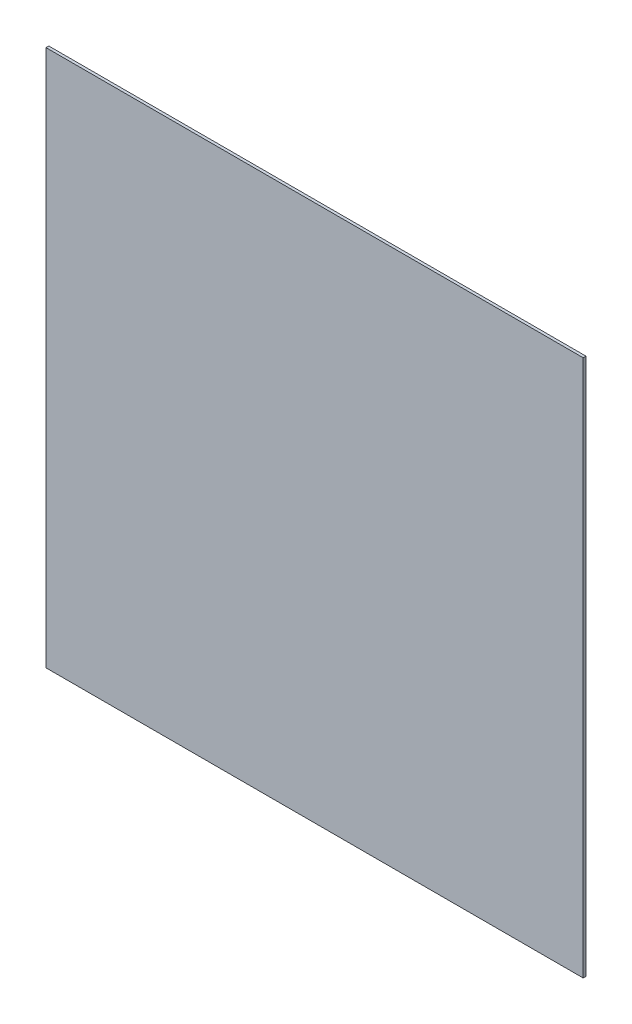
ISO-10303-21;
HEADER;
FILE_DESCRIPTION(('STEP AP214'),'2;1');
FILE_NAME('part.step','',(''),(''),'','','');
FILE_SCHEMA(('AUTOMOTIVE_DESIGN { 1 0 10303 214 1 1 1 1 }'));
ENDSEC;
DATA;
#1=APPLICATION_CONTEXT('core data for automotive mechanical design processes');
#2=APPLICATION_PROTOCOL_DEFINITION('international standard','automotive_design',2000,#1);
#3=PRODUCT_CONTEXT('',#1,'mechanical');
#4=PRODUCT('Part','Part','',(#3));
#5=PRODUCT_RELATED_PRODUCT_CATEGORY('part','',(#4));
#6=PRODUCT_DEFINITION_FORMATION('','',#4);
#7=PRODUCT_DEFINITION_CONTEXT('part definition',#1,'design');
#8=PRODUCT_DEFINITION('design','',#6,#7);
#9=PRODUCT_DEFINITION_SHAPE('','',#8);
#10=(LENGTH_UNIT() NAMED_UNIT(*) SI_UNIT(.MILLI.,.METRE.));
#11=(NAMED_UNIT(*) PLANE_ANGLE_UNIT() SI_UNIT($,.RADIAN.));
#12=(NAMED_UNIT(*) SI_UNIT($,.STERADIAN.) SOLID_ANGLE_UNIT());
#13=UNCERTAINTY_MEASURE_WITH_UNIT(LENGTH_MEASURE(1.E-05),#10,'distance_accuracy_value','');
#14=(GEOMETRIC_REPRESENTATION_CONTEXT(3) GLOBAL_UNCERTAINTY_ASSIGNED_CONTEXT((#13)) GLOBAL_UNIT_ASSIGNED_CONTEXT((#10,
#11,#12)) REPRESENTATION_CONTEXT('',''));
#15=CARTESIAN_POINT('',(0.,0.,0.));
#16=DIRECTION('',(0.,0.,1.));
#17=DIRECTION('',(1.,0.,0.));
#18=AXIS2_PLACEMENT_3D('',#15,#16,#17);
#19=CARTESIAN_POINT('',(-152.4,-152.4,0.79375));
#20=DIRECTION('',(1.,0.,0.));
#21=DIRECTION('',(0.,0.,-1.));
#22=AXIS2_PLACEMENT_3D('',#19,#20,#21);
#23=PLANE('',#22);
#24=DIRECTION('',(0.,-1.,0.));
#25=VECTOR('',#24,1.);
#26=CARTESIAN_POINT('',(-152.4,-152.4,-0.79375));
#27=LINE('',#26,#25);
#28=CARTESIAN_POINT('',(-152.4,152.4,-0.79375));
#29=VERTEX_POINT('',#28);
#30=CARTESIAN_POINT('',(-152.4,-152.4,-0.79375));
#31=VERTEX_POINT('',#30);
#32=EDGE_CURVE('E95',#29,#31,#27,.T.);
#33=ORIENTED_EDGE('',*,*,#32,.T.);
#34=DIRECTION('',(0.,0.,-1.));
#35=VECTOR('',#34,1.);
#36=CARTESIAN_POINT('',(-152.4,-152.4,0.79375));
#37=LINE('',#36,#35);
#38=CARTESIAN_POINT('',(-152.4,-152.4,0.79375));
#39=VERTEX_POINT('',#38);
#40=EDGE_CURVE('E11',#39,#31,#37,.T.);
#41=ORIENTED_EDGE('',*,*,#40,.F.);
#42=DIRECTION('',(0.,-1.,0.));
#43=VECTOR('',#42,1.);
#44=CARTESIAN_POINT('',(-152.4,-152.4,0.79375));
#45=LINE('',#44,#43);
#46=CARTESIAN_POINT('',(-152.4,152.4,0.79375));
#47=VERTEX_POINT('',#46);
#48=EDGE_CURVE('E83',#47,#39,#45,.T.);
#49=ORIENTED_EDGE('',*,*,#48,.F.);
#50=DIRECTION('',(0.,0.,-1.));
#51=VECTOR('',#50,1.);
#52=CARTESIAN_POINT('',(-152.4,152.4,0.79375));
#53=LINE('',#52,#51);
#54=EDGE_CURVE('E91',#47,#29,#53,.T.);
#55=ORIENTED_EDGE('',*,*,#54,.T.);
#56=EDGE_LOOP('',(#33,#41,#49,#55));
#57=FACE_BOUND('',#56,.T.);
#58=ADVANCED_FACE('F32',(#57),#23,.F.);
#59=CARTESIAN_POINT('',(152.4,-152.4,0.79375));
#60=DIRECTION('',(0.,1.,0.));
#61=DIRECTION('',(0.,0.,1.));
#62=AXIS2_PLACEMENT_3D('',#59,#60,#61);
#63=PLANE('',#62);
#64=DIRECTION('',(1.,0.,0.));
#65=VECTOR('',#64,1.);
#66=CARTESIAN_POINT('',(152.4,-152.4,-0.79375));
#67=LINE('',#66,#65);
#68=CARTESIAN_POINT('',(152.4,-152.4,-0.79375));
#69=VERTEX_POINT('',#68);
#70=EDGE_CURVE('E87',#31,#69,#67,.T.);
#71=ORIENTED_EDGE('',*,*,#70,.T.);
#72=DIRECTION('',(0.,0.,-1.));
#73=VECTOR('',#72,1.);
#74=CARTESIAN_POINT('',(152.4,-152.4,0.79375));
#75=LINE('',#74,#73);
#76=CARTESIAN_POINT('',(152.4,-152.4,0.79375));
#77=VERTEX_POINT('',#76);
#78=EDGE_CURVE('E40',#77,#69,#75,.T.);
#79=ORIENTED_EDGE('',*,*,#78,.F.);
#80=DIRECTION('',(1.,0.,0.));
#81=VECTOR('',#80,1.);
#82=CARTESIAN_POINT('',(152.4,-152.4,0.79375));
#83=LINE('',#82,#81);
#84=EDGE_CURVE('E78',#39,#77,#83,.T.);
#85=ORIENTED_EDGE('',*,*,#84,.F.);
#86=ORIENTED_EDGE('',*,*,#40,.T.);
#87=EDGE_LOOP('',(#71,#79,#85,#86));
#88=FACE_BOUND('',#87,.T.);
#89=ADVANCED_FACE('F86',(#88),#63,.F.);
#90=CARTESIAN_POINT('',(152.4,-152.4,0.79375));
#91=DIRECTION('',(-1.,0.,0.));
#92=DIRECTION('',(0.,-1.,0.));
#93=AXIS2_PLACEMENT_3D('',#90,#91,#92);
#94=PLANE('',#93);
#95=DIRECTION('',(0.,1.,0.));
#96=VECTOR('',#95,1.);
#97=CARTESIAN_POINT('',(152.4,-152.4,-0.79375));
#98=LINE('',#97,#96);
#99=CARTESIAN_POINT('',(152.4,152.4,-0.79375));
#100=VERTEX_POINT('',#99);
#101=EDGE_CURVE('E65',#69,#100,#98,.T.);
#102=ORIENTED_EDGE('',*,*,#101,.T.);
#103=DIRECTION('',(0.,0.,-1.));
#104=VECTOR('',#103,1.);
#105=CARTESIAN_POINT('',(152.4,152.4,0.79375));
#106=LINE('',#105,#104);
#107=CARTESIAN_POINT('',(152.4,152.4,0.79375));
#108=VERTEX_POINT('',#107);
#109=EDGE_CURVE('E88',#108,#100,#106,.T.);
#110=ORIENTED_EDGE('',*,*,#109,.F.);
#111=DIRECTION('',(0.,1.,0.));
#112=VECTOR('',#111,1.);
#113=CARTESIAN_POINT('',(152.4,-152.4,0.79375));
#114=LINE('',#113,#112);
#115=EDGE_CURVE('E81',#77,#108,#114,.T.);
#116=ORIENTED_EDGE('',*,*,#115,.F.);
#117=ORIENTED_EDGE('',*,*,#78,.T.);
#118=EDGE_LOOP('',(#102,#110,#116,#117));
#119=FACE_BOUND('',#118,.T.);
#120=ADVANCED_FACE('F89',(#119),#94,.F.);
#121=CARTESIAN_POINT('',(152.4,152.4,0.79375));
#122=DIRECTION('',(0.,-1.,0.));
#123=DIRECTION('',(0.,0.,-1.));
#124=AXIS2_PLACEMENT_3D('',#121,#122,#123);
#125=PLANE('',#124);
#126=DIRECTION('',(-1.,0.,0.));
#127=VECTOR('',#126,1.);
#128=CARTESIAN_POINT('',(152.4,152.4,-0.79375));
#129=LINE('',#128,#127);
#130=EDGE_CURVE('E71',#100,#29,#129,.T.);
#131=ORIENTED_EDGE('',*,*,#130,.T.);
#132=ORIENTED_EDGE('',*,*,#54,.F.);
#133=DIRECTION('',(-1.,0.,0.));
#134=VECTOR('',#133,1.);
#135=CARTESIAN_POINT('',(152.4,152.4,0.79375));
#136=LINE('',#135,#134);
#137=EDGE_CURVE('E48',#108,#47,#136,.T.);
#138=ORIENTED_EDGE('',*,*,#137,.F.);
#139=ORIENTED_EDGE('',*,*,#109,.T.);
#140=EDGE_LOOP('',(#131,#132,#138,#139));
#141=FACE_BOUND('',#140,.T.);
#142=ADVANCED_FACE('F102',(#141),#125,.F.);
#143=CARTESIAN_POINT('',(0.,0.,0.79375));
#144=DIRECTION('',(0.,0.,1.));
#145=DIRECTION('',(1.,0.,0.));
#146=AXIS2_PLACEMENT_3D('',#143,#144,#145);
#147=PLANE('',#146);
#148=ORIENTED_EDGE('',*,*,#48,.T.);
#149=ORIENTED_EDGE('',*,*,#84,.T.);
#150=ORIENTED_EDGE('',*,*,#115,.T.);
#151=ORIENTED_EDGE('',*,*,#137,.T.);
#152=EDGE_LOOP('',(#148,#149,#150,#151));
#153=FACE_BOUND('',#152,.T.);
#154=ADVANCED_FACE('F79',(#153),#147,.T.);
#155=CARTESIAN_POINT('',(0.,0.,-0.79375));
#156=DIRECTION('',(0.,0.,1.));
#157=DIRECTION('',(1.,0.,0.));
#158=AXIS2_PLACEMENT_3D('',#155,#156,#157);
#159=PLANE('',#158);
#160=ORIENTED_EDGE('',*,*,#32,.F.);
#161=ORIENTED_EDGE('',*,*,#130,.F.);
#162=ORIENTED_EDGE('',*,*,#101,.F.);
#163=ORIENTED_EDGE('',*,*,#70,.F.);
#164=EDGE_LOOP('',(#160,#161,#162,#163));
#165=FACE_BOUND('',#164,.T.);
#166=ADVANCED_FACE('F105',(#165),#159,.F.);
#167=CLOSED_SHELL('',(#58,#89,#120,#142,#154,#166));
#168=MANIFOLD_SOLID_BREP('B2',#167);
#169=ADVANCED_BREP_SHAPE_REPRESENTATION('',(#18,#168),#14);
#170=SHAPE_DEFINITION_REPRESENTATION(#9,#169);
ENDSEC;
END-ISO-10303-21;
